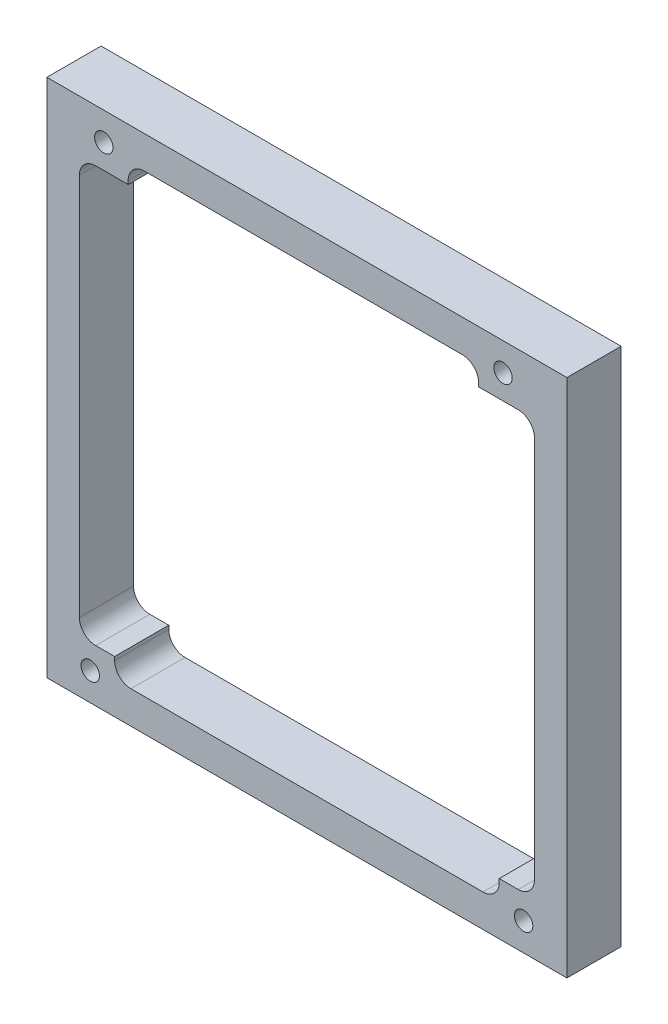
ISO-10303-21;
HEADER;
FILE_DESCRIPTION(('STEP AP214'),'2;1');
FILE_NAME('part.step','',(''),(''),'','','');
FILE_SCHEMA(('AUTOMOTIVE_DESIGN { 1 0 10303 214 1 1 1 1 }'));
ENDSEC;
DATA;
#1=APPLICATION_CONTEXT('core data for automotive mechanical design processes');
#2=APPLICATION_PROTOCOL_DEFINITION('international standard','automotive_design',2000,#1);
#3=PRODUCT_CONTEXT('',#1,'mechanical');
#4=PRODUCT('Part','Part','',(#3));
#5=PRODUCT_RELATED_PRODUCT_CATEGORY('part','',(#4));
#6=PRODUCT_DEFINITION_FORMATION('','',#4);
#7=PRODUCT_DEFINITION_CONTEXT('part definition',#1,'design');
#8=PRODUCT_DEFINITION('design','',#6,#7);
#9=PRODUCT_DEFINITION_SHAPE('','',#8);
#10=(LENGTH_UNIT() NAMED_UNIT(*) SI_UNIT(.MILLI.,.METRE.));
#11=(NAMED_UNIT(*) PLANE_ANGLE_UNIT() SI_UNIT($,.RADIAN.));
#12=(NAMED_UNIT(*) SI_UNIT($,.STERADIAN.) SOLID_ANGLE_UNIT());
#13=UNCERTAINTY_MEASURE_WITH_UNIT(LENGTH_MEASURE(1.E-05),#10,'distance_accuracy_value','');
#14=(GEOMETRIC_REPRESENTATION_CONTEXT(3) GLOBAL_UNCERTAINTY_ASSIGNED_CONTEXT((#13)) GLOBAL_UNIT_ASSIGNED_CONTEXT((#10,
#11,#12)) REPRESENTATION_CONTEXT('',''));
#15=CARTESIAN_POINT('',(0.,0.,0.));
#16=DIRECTION('',(0.,0.,1.));
#17=DIRECTION('',(1.,0.,0.));
#18=AXIS2_PLACEMENT_3D('',#15,#16,#17);
#19=CARTESIAN_POINT('',(0.,-42.,10.));
#20=DIRECTION('',(0.,-1.,0.));
#21=DIRECTION('',(0.,0.,-1.));
#22=AXIS2_PLACEMENT_3D('',#19,#20,#21);
#23=PLANE('',#22);
#24=DIRECTION('',(-1.,0.,0.));
#25=VECTOR('',#24,1.);
#26=CARTESIAN_POINT('',(0.,-42.,10.));
#27=LINE('',#26,#25);
#28=CARTESIAN_POINT('',(32.5,-42.,10.));
#29=VERTEX_POINT('',#28);
#30=CARTESIAN_POINT('',(-32.5,-42.,10.));
#31=VERTEX_POINT('',#30);
#32=EDGE_CURVE('E278',#29,#31,#27,.T.);
#33=ORIENTED_EDGE('',*,*,#32,.F.);
#34=DIRECTION('',(0.,0.,1.));
#35=VECTOR('',#34,1.);
#36=CARTESIAN_POINT('',(32.5,-42.,0.));
#37=LINE('',#36,#35);
#38=CARTESIAN_POINT('',(32.5,-42.,0.));
#39=VERTEX_POINT('',#38);
#40=EDGE_CURVE('E349',#29,#39,#37,.F.);
#41=ORIENTED_EDGE('',*,*,#40,.T.);
#42=DIRECTION('',(-1.,0.,0.));
#43=VECTOR('',#42,1.);
#44=CARTESIAN_POINT('',(0.,-42.,0.));
#45=LINE('',#44,#43);
#46=CARTESIAN_POINT('',(-32.5,-42.,0.));
#47=VERTEX_POINT('',#46);
#48=EDGE_CURVE('E301',#39,#47,#45,.T.);
#49=ORIENTED_EDGE('',*,*,#48,.T.);
#50=DIRECTION('',(0.,0.,1.));
#51=VECTOR('',#50,1.);
#52=CARTESIAN_POINT('',(-32.5,-42.,10.));
#53=LINE('',#52,#51);
#54=EDGE_CURVE('E346',#47,#31,#53,.T.);
#55=ORIENTED_EDGE('',*,*,#54,.T.);
#56=EDGE_LOOP('',(#33,#41,#49,#55));
#57=FACE_BOUND('',#56,.T.);
#58=ADVANCED_FACE('F37',(#57),#23,.F.);
#59=CARTESIAN_POINT('',(0.,42.,10.));
#60=DIRECTION('',(0.,-1.,0.));
#61=DIRECTION('',(0.,0.,-1.));
#62=AXIS2_PLACEMENT_3D('',#59,#60,#61);
#63=PLANE('',#62);
#64=DIRECTION('',(-1.,0.,0.));
#65=VECTOR('',#64,1.);
#66=CARTESIAN_POINT('',(0.,42.,10.));
#67=LINE('',#66,#65);
#68=CARTESIAN_POINT('',(28.7,42.,10.));
#69=VERTEX_POINT('',#68);
#70=CARTESIAN_POINT('',(-30.,42.,10.));
#71=VERTEX_POINT('',#70);
#72=EDGE_CURVE('E284',#69,#71,#67,.T.);
#73=ORIENTED_EDGE('',*,*,#72,.T.);
#74=DIRECTION('',(0.,0.,1.));
#75=VECTOR('',#74,1.);
#76=CARTESIAN_POINT('',(-30.,42.,10.));
#77=LINE('',#76,#75);
#78=CARTESIAN_POINT('',(-30.,42.,0.));
#79=VERTEX_POINT('',#78);
#80=EDGE_CURVE('E333',#71,#79,#77,.F.);
#81=ORIENTED_EDGE('',*,*,#80,.T.);
#82=DIRECTION('',(-1.,0.,0.));
#83=VECTOR('',#82,1.);
#84=CARTESIAN_POINT('',(0.,42.,0.));
#85=LINE('',#84,#83);
#86=CARTESIAN_POINT('',(28.7,42.,0.));
#87=VERTEX_POINT('',#86);
#88=EDGE_CURVE('E307',#87,#79,#85,.T.);
#89=ORIENTED_EDGE('',*,*,#88,.F.);
#90=DIRECTION('',(0.,0.,1.));
#91=VECTOR('',#90,1.);
#92=CARTESIAN_POINT('',(28.7,42.,10.));
#93=LINE('',#92,#91);
#94=EDGE_CURVE('E330',#87,#69,#93,.T.);
#95=ORIENTED_EDGE('',*,*,#94,.T.);
#96=EDGE_LOOP('',(#73,#81,#89,#95));
#97=FACE_BOUND('',#96,.T.);
#98=ADVANCED_FACE('F462',(#97),#63,.T.);
#99=CARTESIAN_POINT('',(42.,0.,10.));
#100=DIRECTION('',(-1.,0.,0.));
#101=DIRECTION('',(0.,0.,1.));
#102=AXIS2_PLACEMENT_3D('',#99,#100,#101);
#103=PLANE('',#102);
#104=DIRECTION('',(0.,1.,0.));
#105=VECTOR('',#104,1.);
#106=CARTESIAN_POINT('',(42.,0.,10.));
#107=LINE('',#106,#105);
#108=CARTESIAN_POINT('',(42.,-35.35,10.));
#109=VERTEX_POINT('',#108);
#110=CARTESIAN_POINT('',(42.,35.35,10.));
#111=VERTEX_POINT('',#110);
#112=EDGE_CURVE('E287',#109,#111,#107,.T.);
#113=ORIENTED_EDGE('',*,*,#112,.T.);
#114=DIRECTION('',(0.,0.,1.));
#115=VECTOR('',#114,1.);
#116=CARTESIAN_POINT('',(42.,35.35,10.));
#117=LINE('',#116,#115);
#118=CARTESIAN_POINT('',(42.,35.35,0.));
#119=VERTEX_POINT('',#118);
#120=EDGE_CURVE('E343',#111,#119,#117,.F.);
#121=ORIENTED_EDGE('',*,*,#120,.T.);
#122=DIRECTION('',(0.,1.,0.));
#123=VECTOR('',#122,1.);
#124=CARTESIAN_POINT('',(42.,0.,0.));
#125=LINE('',#124,#123);
#126=CARTESIAN_POINT('',(42.,-35.35,0.));
#127=VERTEX_POINT('',#126);
#128=EDGE_CURVE('E271',#127,#119,#125,.T.);
#129=ORIENTED_EDGE('',*,*,#128,.F.);
#130=DIRECTION('',(0.,0.,1.));
#131=VECTOR('',#130,1.);
#132=CARTESIAN_POINT('',(42.,-35.35,10.));
#133=LINE('',#132,#131);
#134=EDGE_CURVE('E340',#127,#109,#133,.T.);
#135=ORIENTED_EDGE('',*,*,#134,.T.);
#136=EDGE_LOOP('',(#113,#121,#129,#135));
#137=FACE_BOUND('',#136,.T.);
#138=ADVANCED_FACE('F467',(#137),#103,.T.);
#139=CARTESIAN_POINT('',(-42.,0.,10.));
#140=DIRECTION('',(-1.,0.,0.));
#141=DIRECTION('',(0.,0.,1.));
#142=AXIS2_PLACEMENT_3D('',#139,#140,#141);
#143=PLANE('',#142);
#144=DIRECTION('',(0.,1.,0.));
#145=VECTOR('',#144,1.);
#146=CARTESIAN_POINT('',(-42.,0.,0.));
#147=LINE('',#146,#145);
#148=CARTESIAN_POINT('',(-42.,-35.35,0.));
#149=VERTEX_POINT('',#148);
#150=CARTESIAN_POINT('',(-42.,35.35,0.));
#151=VERTEX_POINT('',#150);
#152=EDGE_CURVE('E304',#149,#151,#147,.T.);
#153=ORIENTED_EDGE('',*,*,#152,.T.);
#154=DIRECTION('',(0.,0.,1.));
#155=VECTOR('',#154,1.);
#156=CARTESIAN_POINT('',(-42.,35.35,10.));
#157=LINE('',#156,#155);
#158=CARTESIAN_POINT('',(-42.,35.35,10.));
#159=VERTEX_POINT('',#158);
#160=EDGE_CURVE('E322',#151,#159,#157,.T.);
#161=ORIENTED_EDGE('',*,*,#160,.T.);
#162=DIRECTION('',(0.,1.,0.));
#163=VECTOR('',#162,1.);
#164=CARTESIAN_POINT('',(-42.,0.,10.));
#165=LINE('',#164,#163);
#166=CARTESIAN_POINT('',(-42.,-35.35,10.));
#167=VERTEX_POINT('',#166);
#168=EDGE_CURVE('E281',#167,#159,#165,.T.);
#169=ORIENTED_EDGE('',*,*,#168,.F.);
#170=DIRECTION('',(0.,0.,1.));
#171=VECTOR('',#170,1.);
#172=CARTESIAN_POINT('',(-42.,-35.35,10.));
#173=LINE('',#172,#171);
#174=EDGE_CURVE('E320',#167,#149,#173,.F.);
#175=ORIENTED_EDGE('',*,*,#174,.T.);
#176=EDGE_LOOP('',(#153,#161,#169,#175));
#177=FACE_BOUND('',#176,.T.);
#178=ADVANCED_FACE('F386',(#177),#143,.F.);
#179=CARTESIAN_POINT('',(-48.,0.,10.));
#180=DIRECTION('',(-1.,0.,0.));
#181=DIRECTION('',(0.,0.,1.));
#182=AXIS2_PLACEMENT_3D('',#179,#180,#181);
#183=PLANE('',#182);
#184=DIRECTION('',(0.,1.,0.));
#185=VECTOR('',#184,1.);
#186=CARTESIAN_POINT('',(-48.,0.,0.));
#187=LINE('',#186,#185);
#188=CARTESIAN_POINT('',(-48.,-48.,0.));
#189=VERTEX_POINT('',#188);
#190=CARTESIAN_POINT('',(-48.,48.,0.));
#191=VERTEX_POINT('',#190);
#192=EDGE_CURVE('E256',#189,#191,#187,.T.);
#193=ORIENTED_EDGE('',*,*,#192,.F.);
#194=DIRECTION('',(0.,0.,-1.));
#195=VECTOR('',#194,1.);
#196=CARTESIAN_POINT('',(-48.,-48.,10.));
#197=LINE('',#196,#195);
#198=CARTESIAN_POINT('',(-48.,-48.,10.));
#199=VERTEX_POINT('',#198);
#200=EDGE_CURVE('E318',#199,#189,#197,.T.);
#201=ORIENTED_EDGE('',*,*,#200,.F.);
#202=DIRECTION('',(0.,1.,0.));
#203=VECTOR('',#202,1.);
#204=CARTESIAN_POINT('',(-48.,0.,10.));
#205=LINE('',#204,#203);
#206=CARTESIAN_POINT('',(-48.,48.,10.));
#207=VERTEX_POINT('',#206);
#208=EDGE_CURVE('E267',#199,#207,#205,.T.);
#209=ORIENTED_EDGE('',*,*,#208,.T.);
#210=DIRECTION('',(0.,0.,-1.));
#211=VECTOR('',#210,1.);
#212=CARTESIAN_POINT('',(-48.,48.,10.));
#213=LINE('',#212,#211);
#214=EDGE_CURVE('E290',#207,#191,#213,.T.);
#215=ORIENTED_EDGE('',*,*,#214,.T.);
#216=EDGE_LOOP('',(#193,#201,#209,#215));
#217=FACE_BOUND('',#216,.T.);
#218=ADVANCED_FACE('F483',(#217),#183,.T.);
#219=CARTESIAN_POINT('',(0.,-48.,10.));
#220=DIRECTION('',(0.,-1.,0.));
#221=DIRECTION('',(1.,0.,0.));
#222=AXIS2_PLACEMENT_3D('',#219,#220,#221);
#223=PLANE('',#222);
#224=DIRECTION('',(-1.,0.,0.));
#225=VECTOR('',#224,1.);
#226=CARTESIAN_POINT('',(0.,-48.,0.));
#227=LINE('',#226,#225);
#228=CARTESIAN_POINT('',(48.,-48.,0.));
#229=VERTEX_POINT('',#228);
#230=EDGE_CURVE('E293',#229,#189,#227,.T.);
#231=ORIENTED_EDGE('',*,*,#230,.F.);
#232=DIRECTION('',(0.,0.,-1.));
#233=VECTOR('',#232,1.);
#234=CARTESIAN_POINT('',(48.,-48.,10.));
#235=LINE('',#234,#233);
#236=CARTESIAN_POINT('',(48.,-48.,10.));
#237=VERTEX_POINT('',#236);
#238=EDGE_CURVE('E316',#237,#229,#235,.T.);
#239=ORIENTED_EDGE('',*,*,#238,.F.);
#240=DIRECTION('',(-1.,0.,0.));
#241=VECTOR('',#240,1.);
#242=CARTESIAN_POINT('',(0.,-48.,10.));
#243=LINE('',#242,#241);
#244=EDGE_CURVE('E270',#237,#199,#243,.T.);
#245=ORIENTED_EDGE('',*,*,#244,.T.);
#246=ORIENTED_EDGE('',*,*,#200,.T.);
#247=EDGE_LOOP('',(#231,#239,#245,#246));
#248=FACE_BOUND('',#247,.T.);
#249=ADVANCED_FACE('F479',(#248),#223,.T.);
#250=CARTESIAN_POINT('',(48.,0.,10.));
#251=DIRECTION('',(-1.,0.,0.));
#252=DIRECTION('',(0.,0.,1.));
#253=AXIS2_PLACEMENT_3D('',#250,#251,#252);
#254=PLANE('',#253);
#255=DIRECTION('',(0.,1.,0.));
#256=VECTOR('',#255,1.);
#257=CARTESIAN_POINT('',(48.,0.,0.));
#258=LINE('',#257,#256);
#259=CARTESIAN_POINT('',(48.,48.,0.));
#260=VERTEX_POINT('',#259);
#261=EDGE_CURVE('E296',#229,#260,#258,.T.);
#262=ORIENTED_EDGE('',*,*,#261,.T.);
#263=DIRECTION('',(0.,0.,-1.));
#264=VECTOR('',#263,1.);
#265=CARTESIAN_POINT('',(48.,48.,10.));
#266=LINE('',#265,#264);
#267=CARTESIAN_POINT('',(48.,48.,10.));
#268=VERTEX_POINT('',#267);
#269=EDGE_CURVE('E313',#268,#260,#266,.T.);
#270=ORIENTED_EDGE('',*,*,#269,.F.);
#271=DIRECTION('',(0.,1.,0.));
#272=VECTOR('',#271,1.);
#273=CARTESIAN_POINT('',(48.,0.,10.));
#274=LINE('',#273,#272);
#275=EDGE_CURVE('E274',#237,#268,#274,.T.);
#276=ORIENTED_EDGE('',*,*,#275,.F.);
#277=ORIENTED_EDGE('',*,*,#238,.T.);
#278=EDGE_LOOP('',(#262,#270,#276,#277));
#279=FACE_BOUND('',#278,.T.);
#280=ADVANCED_FACE('F475',(#279),#254,.F.);
#281=CARTESIAN_POINT('',(0.,48.,10.));
#282=DIRECTION('',(0.,-1.,0.));
#283=DIRECTION('',(1.,0.,0.));
#284=AXIS2_PLACEMENT_3D('',#281,#282,#283);
#285=PLANE('',#284);
#286=DIRECTION('',(-1.,0.,0.));
#287=VECTOR('',#286,1.);
#288=CARTESIAN_POINT('',(0.,48.,0.));
#289=LINE('',#288,#287);
#290=EDGE_CURVE('E298',#260,#191,#289,.T.);
#291=ORIENTED_EDGE('',*,*,#290,.T.);
#292=ORIENTED_EDGE('',*,*,#214,.F.);
#293=DIRECTION('',(-1.,0.,0.));
#294=VECTOR('',#293,1.);
#295=CARTESIAN_POINT('',(0.,48.,10.));
#296=LINE('',#295,#294);
#297=EDGE_CURVE('E276',#268,#207,#296,.T.);
#298=ORIENTED_EDGE('',*,*,#297,.F.);
#299=ORIENTED_EDGE('',*,*,#269,.T.);
#300=EDGE_LOOP('',(#291,#292,#298,#299));
#301=FACE_BOUND('',#300,.T.);
#302=ADVANCED_FACE('F472',(#301),#285,.F.);
#303=CARTESIAN_POINT('',(0.,0.,10.));
#304=DIRECTION('',(0.,0.,1.));
#305=DIRECTION('',(1.,0.,0.));
#306=AXIS2_PLACEMENT_3D('',#303,#304,#305);
#307=PLANE('',#306);
#308=CARTESIAN_POINT('',(36.2,42.85,10.));
#309=DIRECTION('',(0.,0.,-1.));
#310=DIRECTION('',(-1.,0.,0.));
#311=AXIS2_PLACEMENT_3D('',#308,#309,#310);
#312=CIRCLE('',#311,1.7);
#313=CARTESIAN_POINT('',(34.5,42.85,10.));
#314=VERTEX_POINT('',#313);
#315=EDGE_CURVE('E428',#314,#314,#312,.T.);
#316=ORIENTED_EDGE('',*,*,#315,.T.);
#317=EDGE_LOOP('',(#316));
#318=FACE_BOUND('',#317,.T.);
#319=CARTESIAN_POINT('',(-37.5,42.85,10.));
#320=DIRECTION('',(0.,0.,-1.));
#321=DIRECTION('',(-1.,0.,0.));
#322=AXIS2_PLACEMENT_3D('',#319,#320,#321);
#323=CIRCLE('',#322,1.7);
#324=CARTESIAN_POINT('',(-39.2,42.85,10.));
#325=VERTEX_POINT('',#324);
#326=EDGE_CURVE('E422',#325,#325,#323,.T.);
#327=ORIENTED_EDGE('',*,*,#326,.T.);
#328=EDGE_LOOP('',(#327));
#329=FACE_BOUND('',#328,.T.);
#330=CARTESIAN_POINT('',(-40.,-42.85,10.));
#331=DIRECTION('',(0.,0.,-1.));
#332=DIRECTION('',(-1.,0.,0.));
#333=AXIS2_PLACEMENT_3D('',#330,#331,#332);
#334=CIRCLE('',#333,1.7);
#335=CARTESIAN_POINT('',(-41.7,-42.85,10.));
#336=VERTEX_POINT('',#335);
#337=EDGE_CURVE('E416',#336,#336,#334,.T.);
#338=ORIENTED_EDGE('',*,*,#337,.T.);
#339=EDGE_LOOP('',(#338));
#340=FACE_BOUND('',#339,.T.);
#341=CARTESIAN_POINT('',(40.,-42.85,10.));
#342=DIRECTION('',(0.,0.,-1.));
#343=DIRECTION('',(-1.,0.,0.));
#344=AXIS2_PLACEMENT_3D('',#341,#342,#343);
#345=CIRCLE('',#344,1.7);
#346=CARTESIAN_POINT('',(38.3,-42.85,10.));
#347=VERTEX_POINT('',#346);
#348=EDGE_CURVE('E217',#347,#347,#345,.T.);
#349=ORIENTED_EDGE('',*,*,#348,.T.);
#350=EDGE_LOOP('',(#349));
#351=FACE_BOUND('',#350,.T.);
#352=DIRECTION('',(0.,1.,0.));
#353=VECTOR('',#352,1.);
#354=CARTESIAN_POINT('',(35.5,0.,10.));
#355=LINE('',#354,#353);
#356=CARTESIAN_POINT('',(35.5,-39.,10.));
#357=VERTEX_POINT('',#356);
#358=CARTESIAN_POINT('',(35.5,-38.35,10.));
#359=VERTEX_POINT('',#358);
#360=EDGE_CURVE('E201',#357,#359,#355,.T.);
#361=ORIENTED_EDGE('',*,*,#360,.F.);
#362=CARTESIAN_POINT('',(32.5,-39.,10.));
#363=DIRECTION('',(0.,0.,1.));
#364=DIRECTION('',(1.,0.,0.));
#365=AXIS2_PLACEMENT_3D('',#362,#363,#364);
#366=CIRCLE('',#365,3.);
#367=EDGE_CURVE('E373',#357,#29,#366,.F.);
#368=ORIENTED_EDGE('',*,*,#367,.T.);
#369=ORIENTED_EDGE('',*,*,#32,.T.);
#370=CARTESIAN_POINT('',(-32.5,-39.,10.));
#371=DIRECTION('',(0.,0.,1.));
#372=DIRECTION('',(1.,0.,0.));
#373=AXIS2_PLACEMENT_3D('',#370,#371,#372);
#374=CIRCLE('',#373,3.);
#375=CARTESIAN_POINT('',(-35.5,-39.,10.));
#376=VERTEX_POINT('',#375);
#377=EDGE_CURVE('E380',#31,#376,#374,.F.);
#378=ORIENTED_EDGE('',*,*,#377,.T.);
#379=DIRECTION('',(0.,1.,0.));
#380=VECTOR('',#379,1.);
#381=CARTESIAN_POINT('',(-35.5,0.,10.));
#382=LINE('',#381,#380);
#383=CARTESIAN_POINT('',(-35.5,-38.35,10.));
#384=VERTEX_POINT('',#383);
#385=EDGE_CURVE('E231',#376,#384,#382,.T.);
#386=ORIENTED_EDGE('',*,*,#385,.T.);
#387=DIRECTION('',(-1.,0.,0.));
#388=VECTOR('',#387,1.);
#389=CARTESIAN_POINT('',(0.,-38.35,10.));
#390=LINE('',#389,#388);
#391=CARTESIAN_POINT('',(-39.,-38.35,10.));
#392=VERTEX_POINT('',#391);
#393=EDGE_CURVE('E233',#384,#392,#390,.T.);
#394=ORIENTED_EDGE('',*,*,#393,.T.);
#395=CARTESIAN_POINT('',(-39.,-35.35,10.));
#396=DIRECTION('',(0.,0.,1.));
#397=DIRECTION('',(1.,0.,0.));
#398=AXIS2_PLACEMENT_3D('',#395,#396,#397);
#399=CIRCLE('',#398,3.);
#400=EDGE_CURVE('E45',#392,#167,#399,.F.);
#401=ORIENTED_EDGE('',*,*,#400,.T.);
#402=ORIENTED_EDGE('',*,*,#168,.T.);
#403=CARTESIAN_POINT('',(-39.,35.35,10.));
#404=DIRECTION('',(0.,0.,1.));
#405=DIRECTION('',(1.,0.,0.));
#406=AXIS2_PLACEMENT_3D('',#403,#404,#405);
#407=CIRCLE('',#406,3.);
#408=CARTESIAN_POINT('',(-39.,38.35,10.));
#409=VERTEX_POINT('',#408);
#410=EDGE_CURVE('E357',#159,#409,#407,.F.);
#411=ORIENTED_EDGE('',*,*,#410,.T.);
#412=DIRECTION('',(1.,0.,0.));
#413=VECTOR('',#412,1.);
#414=CARTESIAN_POINT('',(0.,38.3500000000001,10.));
#415=LINE('',#414,#413);
#416=CARTESIAN_POINT('',(-33.,38.35,10.));
#417=VERTEX_POINT('',#416);
#418=EDGE_CURVE('E249',#409,#417,#415,.T.);
#419=ORIENTED_EDGE('',*,*,#418,.T.);
#420=DIRECTION('',(0.,-1.,0.));
#421=VECTOR('',#420,1.);
#422=CARTESIAN_POINT('',(-33.,0.,10.));
#423=LINE('',#422,#421);
#424=CARTESIAN_POINT('',(-33.,39.,10.));
#425=VERTEX_POINT('',#424);
#426=EDGE_CURVE('E239',#425,#417,#423,.T.);
#427=ORIENTED_EDGE('',*,*,#426,.F.);
#428=CARTESIAN_POINT('',(-30.,39.,10.));
#429=DIRECTION('',(0.,0.,1.));
#430=DIRECTION('',(1.,0.,0.));
#431=AXIS2_PLACEMENT_3D('',#428,#429,#430);
#432=CIRCLE('',#431,3.);
#433=EDGE_CURVE('E361',#425,#71,#432,.F.);
#434=ORIENTED_EDGE('',*,*,#433,.T.);
#435=ORIENTED_EDGE('',*,*,#72,.F.);
#436=CARTESIAN_POINT('',(28.7,39.,10.));
#437=DIRECTION('',(0.,0.,1.));
#438=DIRECTION('',(1.,0.,0.));
#439=AXIS2_PLACEMENT_3D('',#436,#437,#438);
#440=CIRCLE('',#439,3.);
#441=CARTESIAN_POINT('',(31.7,39.,10.));
#442=VERTEX_POINT('',#441);
#443=EDGE_CURVE('E365',#69,#442,#440,.F.);
#444=ORIENTED_EDGE('',*,*,#443,.T.);
#445=DIRECTION('',(0.,1.,0.));
#446=VECTOR('',#445,1.);
#447=CARTESIAN_POINT('',(31.7,0.,10.));
#448=LINE('',#447,#446);
#449=CARTESIAN_POINT('',(31.7,38.35,10.));
#450=VERTEX_POINT('',#449);
#451=EDGE_CURVE('E247',#450,#442,#448,.T.);
#452=ORIENTED_EDGE('',*,*,#451,.F.);
#453=DIRECTION('',(-1.,0.,0.));
#454=VECTOR('',#453,1.);
#455=CARTESIAN_POINT('',(0.,38.35,10.));
#456=LINE('',#455,#454);
#457=CARTESIAN_POINT('',(39.,38.35,10.));
#458=VERTEX_POINT('',#457);
#459=EDGE_CURVE('E260',#458,#450,#456,.T.);
#460=ORIENTED_EDGE('',*,*,#459,.F.);
#461=CARTESIAN_POINT('',(39.,35.35,10.));
#462=DIRECTION('',(0.,0.,1.));
#463=DIRECTION('',(1.,0.,0.));
#464=AXIS2_PLACEMENT_3D('',#461,#462,#463);
#465=CIRCLE('',#464,3.);
#466=EDGE_CURVE('E369',#458,#111,#465,.F.);
#467=ORIENTED_EDGE('',*,*,#466,.T.);
#468=ORIENTED_EDGE('',*,*,#112,.F.);
#469=CARTESIAN_POINT('',(39.,-35.35,10.));
#470=DIRECTION('',(0.,0.,1.));
#471=DIRECTION('',(1.,0.,0.));
#472=AXIS2_PLACEMENT_3D('',#469,#470,#471);
#473=CIRCLE('',#472,3.);
#474=CARTESIAN_POINT('',(39.,-38.35,10.));
#475=VERTEX_POINT('',#474);
#476=EDGE_CURVE('E203',#109,#475,#473,.F.);
#477=ORIENTED_EDGE('',*,*,#476,.T.);
#478=DIRECTION('',(-1.,0.,0.));
#479=VECTOR('',#478,1.);
#480=CARTESIAN_POINT('',(0.,-38.35,10.));
#481=LINE('',#480,#479);
#482=EDGE_CURVE('E197',#475,#359,#481,.T.);
#483=ORIENTED_EDGE('',*,*,#482,.T.);
#484=EDGE_LOOP('',(#361,#368,#369,#378,#386,#394,#401,#402,#411,#419,#427,#434,#435,#444,#452,
#460,#467,#468,#477,#483));
#485=FACE_BOUND('',#484,.T.);
#486=ORIENTED_EDGE('',*,*,#208,.F.);
#487=ORIENTED_EDGE('',*,*,#244,.F.);
#488=ORIENTED_EDGE('',*,*,#275,.T.);
#489=ORIENTED_EDGE('',*,*,#297,.T.);
#490=EDGE_LOOP('',(#486,#487,#488,#489));
#491=FACE_BOUND('',#490,.T.);
#492=ADVANCED_FACE('F199',(#318,#329,#340,#351,#485,#491),#307,.T.);
#493=CARTESIAN_POINT('',(0.,0.,0.));
#494=DIRECTION('',(0.,0.,1.));
#495=DIRECTION('',(1.,0.,0.));
#496=AXIS2_PLACEMENT_3D('',#493,#494,#495);
#497=PLANE('',#496);
#498=CARTESIAN_POINT('',(36.2,42.85,0.));
#499=DIRECTION('',(0.,0.,-1.));
#500=DIRECTION('',(-1.,0.,0.));
#501=AXIS2_PLACEMENT_3D('',#498,#499,#500);
#502=CIRCLE('',#501,1.7);
#503=CARTESIAN_POINT('',(34.5,42.85,0.));
#504=VERTEX_POINT('',#503);
#505=EDGE_CURVE('E431',#504,#504,#502,.T.);
#506=ORIENTED_EDGE('',*,*,#505,.F.);
#507=EDGE_LOOP('',(#506));
#508=FACE_BOUND('',#507,.T.);
#509=CARTESIAN_POINT('',(-37.5,42.85,0.));
#510=DIRECTION('',(0.,0.,-1.));
#511=DIRECTION('',(-1.,0.,0.));
#512=AXIS2_PLACEMENT_3D('',#509,#510,#511);
#513=CIRCLE('',#512,1.7);
#514=CARTESIAN_POINT('',(-39.2,42.85,0.));
#515=VERTEX_POINT('',#514);
#516=EDGE_CURVE('E425',#515,#515,#513,.T.);
#517=ORIENTED_EDGE('',*,*,#516,.F.);
#518=EDGE_LOOP('',(#517));
#519=FACE_BOUND('',#518,.T.);
#520=CARTESIAN_POINT('',(-40.,-42.85,0.));
#521=DIRECTION('',(0.,0.,-1.));
#522=DIRECTION('',(-1.,0.,0.));
#523=AXIS2_PLACEMENT_3D('',#520,#521,#522);
#524=CIRCLE('',#523,1.7);
#525=CARTESIAN_POINT('',(-41.7,-42.85,0.));
#526=VERTEX_POINT('',#525);
#527=EDGE_CURVE('E419',#526,#526,#524,.T.);
#528=ORIENTED_EDGE('',*,*,#527,.F.);
#529=EDGE_LOOP('',(#528));
#530=FACE_BOUND('',#529,.T.);
#531=CARTESIAN_POINT('',(40.,-42.85,0.));
#532=DIRECTION('',(0.,0.,-1.));
#533=DIRECTION('',(-1.,0.,0.));
#534=AXIS2_PLACEMENT_3D('',#531,#532,#533);
#535=CIRCLE('',#534,1.7);
#536=CARTESIAN_POINT('',(38.3,-42.85,0.));
#537=VERTEX_POINT('',#536);
#538=EDGE_CURVE('E413',#537,#537,#535,.T.);
#539=ORIENTED_EDGE('',*,*,#538,.F.);
#540=EDGE_LOOP('',(#539));
#541=FACE_BOUND('',#540,.T.);
#542=ORIENTED_EDGE('',*,*,#48,.F.);
#543=CARTESIAN_POINT('',(32.5,-39.,0.));
#544=DIRECTION('',(0.,0.,1.));
#545=DIRECTION('',(1.,0.,0.));
#546=AXIS2_PLACEMENT_3D('',#543,#544,#545);
#547=CIRCLE('',#546,3.);
#548=CARTESIAN_POINT('',(35.5,-39.,0.));
#549=VERTEX_POINT('',#548);
#550=EDGE_CURVE('E375',#39,#549,#547,.T.);
#551=ORIENTED_EDGE('',*,*,#550,.T.);
#552=DIRECTION('',(0.,-1.,0.));
#553=VECTOR('',#552,1.);
#554=CARTESIAN_POINT('',(35.5,0.,0.));
#555=LINE('',#554,#553);
#556=CARTESIAN_POINT('',(35.5,-38.35,0.));
#557=VERTEX_POINT('',#556);
#558=EDGE_CURVE('E223',#557,#549,#555,.T.);
#559=ORIENTED_EDGE('',*,*,#558,.F.);
#560=DIRECTION('',(1.,0.,0.));
#561=VECTOR('',#560,1.);
#562=CARTESIAN_POINT('',(0.,-38.35,0.));
#563=LINE('',#562,#561);
#564=CARTESIAN_POINT('',(39.,-38.35,0.));
#565=VERTEX_POINT('',#564);
#566=EDGE_CURVE('E221',#557,#565,#563,.T.);
#567=ORIENTED_EDGE('',*,*,#566,.T.);
#568=CARTESIAN_POINT('',(39.,-35.35,0.));
#569=DIRECTION('',(0.,0.,1.));
#570=DIRECTION('',(1.,0.,0.));
#571=AXIS2_PLACEMENT_3D('',#568,#569,#570);
#572=CIRCLE('',#571,3.);
#573=EDGE_CURVE('E378',#565,#127,#572,.T.);
#574=ORIENTED_EDGE('',*,*,#573,.T.);
#575=ORIENTED_EDGE('',*,*,#128,.T.);
#576=CARTESIAN_POINT('',(39.,35.35,0.));
#577=DIRECTION('',(0.,0.,1.));
#578=DIRECTION('',(1.,0.,0.));
#579=AXIS2_PLACEMENT_3D('',#576,#577,#578);
#580=CIRCLE('',#579,3.);
#581=CARTESIAN_POINT('',(39.,38.35,0.));
#582=VERTEX_POINT('',#581);
#583=EDGE_CURVE('E371',#119,#582,#580,.T.);
#584=ORIENTED_EDGE('',*,*,#583,.T.);
#585=DIRECTION('',(1.,0.,0.));
#586=VECTOR('',#585,1.);
#587=CARTESIAN_POINT('',(0.,38.35,0.));
#588=LINE('',#587,#586);
#589=CARTESIAN_POINT('',(31.7,38.35,0.));
#590=VERTEX_POINT('',#589);
#591=EDGE_CURVE('E257',#590,#582,#588,.T.);
#592=ORIENTED_EDGE('',*,*,#591,.F.);
#593=DIRECTION('',(0.,-1.,0.));
#594=VECTOR('',#593,1.);
#595=CARTESIAN_POINT('',(31.7,0.,0.));
#596=LINE('',#595,#594);
#597=CARTESIAN_POINT('',(31.7,39.,0.));
#598=VERTEX_POINT('',#597);
#599=EDGE_CURVE('E254',#598,#590,#596,.T.);
#600=ORIENTED_EDGE('',*,*,#599,.F.);
#601=CARTESIAN_POINT('',(28.7,39.,0.));
#602=DIRECTION('',(0.,0.,1.));
#603=DIRECTION('',(1.,0.,0.));
#604=AXIS2_PLACEMENT_3D('',#601,#602,#603);
#605=CIRCLE('',#604,3.);
#606=EDGE_CURVE('E367',#598,#87,#605,.T.);
#607=ORIENTED_EDGE('',*,*,#606,.T.);
#608=ORIENTED_EDGE('',*,*,#88,.T.);
#609=CARTESIAN_POINT('',(-30.,39.,0.));
#610=DIRECTION('',(0.,0.,1.));
#611=DIRECTION('',(1.,0.,0.));
#612=AXIS2_PLACEMENT_3D('',#609,#610,#611);
#613=CIRCLE('',#612,3.);
#614=CARTESIAN_POINT('',(-33.,39.,0.));
#615=VERTEX_POINT('',#614);
#616=EDGE_CURVE('E363',#79,#615,#613,.T.);
#617=ORIENTED_EDGE('',*,*,#616,.T.);
#618=DIRECTION('',(0.,1.,0.));
#619=VECTOR('',#618,1.);
#620=CARTESIAN_POINT('',(-33.,0.,0.));
#621=LINE('',#620,#619);
#622=CARTESIAN_POINT('',(-33.,38.35,0.));
#623=VERTEX_POINT('',#622);
#624=EDGE_CURVE('E243',#623,#615,#621,.T.);
#625=ORIENTED_EDGE('',*,*,#624,.F.);
#626=DIRECTION('',(-1.,0.,0.));
#627=VECTOR('',#626,1.);
#628=CARTESIAN_POINT('',(0.,38.3500000000001,0.));
#629=LINE('',#628,#627);
#630=CARTESIAN_POINT('',(-39.,38.35,0.));
#631=VERTEX_POINT('',#630);
#632=EDGE_CURVE('E240',#623,#631,#629,.T.);
#633=ORIENTED_EDGE('',*,*,#632,.T.);
#634=CARTESIAN_POINT('',(-39.,35.35,0.));
#635=DIRECTION('',(0.,0.,1.));
#636=DIRECTION('',(1.,0.,0.));
#637=AXIS2_PLACEMENT_3D('',#634,#635,#636);
#638=CIRCLE('',#637,3.);
#639=EDGE_CURVE('E359',#631,#151,#638,.T.);
#640=ORIENTED_EDGE('',*,*,#639,.T.);
#641=ORIENTED_EDGE('',*,*,#152,.F.);
#642=CARTESIAN_POINT('',(-39.,-35.35,0.));
#643=DIRECTION('',(0.,0.,1.));
#644=DIRECTION('',(1.,0.,0.));
#645=AXIS2_PLACEMENT_3D('',#642,#643,#644);
#646=CIRCLE('',#645,3.);
#647=CARTESIAN_POINT('',(-39.,-38.35,0.));
#648=VERTEX_POINT('',#647);
#649=EDGE_CURVE('E11',#149,#648,#646,.T.);
#650=ORIENTED_EDGE('',*,*,#649,.T.);
#651=DIRECTION('',(1.,0.,0.));
#652=VECTOR('',#651,1.);
#653=CARTESIAN_POINT('',(0.,-38.35,0.));
#654=LINE('',#653,#652);
#655=CARTESIAN_POINT('',(-35.5,-38.35,0.));
#656=VERTEX_POINT('',#655);
#657=EDGE_CURVE('E229',#648,#656,#654,.T.);
#658=ORIENTED_EDGE('',*,*,#657,.T.);
#659=DIRECTION('',(0.,-1.,0.));
#660=VECTOR('',#659,1.);
#661=CARTESIAN_POINT('',(-35.5,0.,0.));
#662=LINE('',#661,#660);
#663=CARTESIAN_POINT('',(-35.5,-39.,0.));
#664=VERTEX_POINT('',#663);
#665=EDGE_CURVE('E226',#656,#664,#662,.T.);
#666=ORIENTED_EDGE('',*,*,#665,.T.);
#667=CARTESIAN_POINT('',(-32.5,-39.,0.));
#668=DIRECTION('',(0.,0.,1.));
#669=DIRECTION('',(1.,0.,0.));
#670=AXIS2_PLACEMENT_3D('',#667,#668,#669);
#671=CIRCLE('',#670,3.);
#672=EDGE_CURVE('E382',#664,#47,#671,.T.);
#673=ORIENTED_EDGE('',*,*,#672,.T.);
#674=EDGE_LOOP('',(#542,#551,#559,#567,#574,#575,#584,#592,#600,#607,#608,#617,#625,#633,#640,
#641,#650,#658,#666,#673));
#675=FACE_BOUND('',#674,.T.);
#676=ORIENTED_EDGE('',*,*,#192,.T.);
#677=ORIENTED_EDGE('',*,*,#290,.F.);
#678=ORIENTED_EDGE('',*,*,#261,.F.);
#679=ORIENTED_EDGE('',*,*,#230,.T.);
#680=EDGE_LOOP('',(#676,#677,#678,#679));
#681=FACE_BOUND('',#680,.T.);
#682=ADVANCED_FACE('F393',(#508,#519,#530,#541,#675,#681),#497,.F.);
#683=CARTESIAN_POINT('',(0.,38.35,-10.9276026648117));
#684=DIRECTION('',(0.,1.,0.));
#685=DIRECTION('',(-1.,0.,0.));
#686=AXIS2_PLACEMENT_3D('',#683,#684,#685);
#687=PLANE('',#686);
#688=ORIENTED_EDGE('',*,*,#591,.T.);
#689=DIRECTION('',(0.,0.,1.));
#690=VECTOR('',#689,1.);
#691=CARTESIAN_POINT('',(39.,38.35,-10.9276026648117));
#692=LINE('',#691,#690);
#693=EDGE_CURVE('E337',#582,#458,#692,.T.);
#694=ORIENTED_EDGE('',*,*,#693,.T.);
#695=ORIENTED_EDGE('',*,*,#459,.T.);
#696=DIRECTION('',(0.,0.,1.));
#697=VECTOR('',#696,1.);
#698=CARTESIAN_POINT('',(31.7,38.35,-10.9276026648117));
#699=LINE('',#698,#697);
#700=EDGE_CURVE('E262',#590,#450,#699,.T.);
#701=ORIENTED_EDGE('',*,*,#700,.F.);
#702=EDGE_LOOP('',(#688,#694,#695,#701));
#703=FACE_BOUND('',#702,.T.);
#704=ADVANCED_FACE('F439',(#703),#687,.F.);
#705=CARTESIAN_POINT('',(31.7,0.,-10.9276026648117));
#706=DIRECTION('',(1.,0.,0.));
#707=DIRECTION('',(0.,0.,-1.));
#708=AXIS2_PLACEMENT_3D('',#705,#706,#707);
#709=PLANE('',#708);
#710=ORIENTED_EDGE('',*,*,#451,.T.);
#711=DIRECTION('',(0.,0.,1.));
#712=VECTOR('',#711,1.);
#713=CARTESIAN_POINT('',(31.7,39.,-10.9276026648117));
#714=LINE('',#713,#712);
#715=EDGE_CURVE('E335',#442,#598,#714,.F.);
#716=ORIENTED_EDGE('',*,*,#715,.T.);
#717=ORIENTED_EDGE('',*,*,#599,.T.);
#718=ORIENTED_EDGE('',*,*,#700,.T.);
#719=EDGE_LOOP('',(#710,#716,#717,#718));
#720=FACE_BOUND('',#719,.T.);
#721=ADVANCED_FACE('F601',(#720),#709,.F.);
#722=CARTESIAN_POINT('',(0.,38.3500000000001,-10.9276026648117));
#723=DIRECTION('',(0.,-1.,0.));
#724=DIRECTION('',(1.,0.,0.));
#725=AXIS2_PLACEMENT_3D('',#722,#723,#724);
#726=PLANE('',#725);
#727=ORIENTED_EDGE('',*,*,#418,.F.);
#728=DIRECTION('',(0.,0.,1.));
#729=VECTOR('',#728,1.);
#730=CARTESIAN_POINT('',(-39.,38.35,-10.9276026648117));
#731=LINE('',#730,#729);
#732=EDGE_CURVE('E325',#409,#631,#731,.F.);
#733=ORIENTED_EDGE('',*,*,#732,.T.);
#734=ORIENTED_EDGE('',*,*,#632,.F.);
#735=DIRECTION('',(0.,0.,1.));
#736=VECTOR('',#735,1.);
#737=CARTESIAN_POINT('',(-33.,38.35,-10.9276026648117));
#738=LINE('',#737,#736);
#739=EDGE_CURVE('E244',#623,#417,#738,.T.);
#740=ORIENTED_EDGE('',*,*,#739,.T.);
#741=EDGE_LOOP('',(#727,#733,#734,#740));
#742=FACE_BOUND('',#741,.T.);
#743=ADVANCED_FACE('F610',(#742),#726,.T.);
#744=CARTESIAN_POINT('',(-33.,0.,-10.9276026648117));
#745=DIRECTION('',(-1.,0.,0.));
#746=DIRECTION('',(0.,0.,1.));
#747=AXIS2_PLACEMENT_3D('',#744,#745,#746);
#748=PLANE('',#747);
#749=ORIENTED_EDGE('',*,*,#624,.T.);
#750=DIRECTION('',(0.,0.,1.));
#751=VECTOR('',#750,1.);
#752=CARTESIAN_POINT('',(-33.,39.,-10.9276026648117));
#753=LINE('',#752,#751);
#754=EDGE_CURVE('E327',#615,#425,#753,.T.);
#755=ORIENTED_EDGE('',*,*,#754,.T.);
#756=ORIENTED_EDGE('',*,*,#426,.T.);
#757=ORIENTED_EDGE('',*,*,#739,.F.);
#758=EDGE_LOOP('',(#749,#755,#756,#757));
#759=FACE_BOUND('',#758,.T.);
#760=ADVANCED_FACE('F618',(#759),#748,.F.);
#761=CARTESIAN_POINT('',(-35.5,0.,-10.9276026648117));
#762=DIRECTION('',(1.,0.,0.));
#763=DIRECTION('',(0.,0.,-1.));
#764=AXIS2_PLACEMENT_3D('',#761,#762,#763);
#765=PLANE('',#764);
#766=ORIENTED_EDGE('',*,*,#385,.F.);
#767=DIRECTION('',(0.,0.,1.));
#768=VECTOR('',#767,1.);
#769=CARTESIAN_POINT('',(-35.5,-39.,-10.9276026648117));
#770=LINE('',#769,#768);
#771=EDGE_CURVE('E353',#376,#664,#770,.F.);
#772=ORIENTED_EDGE('',*,*,#771,.T.);
#773=ORIENTED_EDGE('',*,*,#665,.F.);
#774=DIRECTION('',(0.,0.,1.));
#775=VECTOR('',#774,1.);
#776=CARTESIAN_POINT('',(-35.5,-38.35,-10.9276026648117));
#777=LINE('',#776,#775);
#778=EDGE_CURVE('E230',#656,#384,#777,.T.);
#779=ORIENTED_EDGE('',*,*,#778,.T.);
#780=EDGE_LOOP('',(#766,#772,#773,#779));
#781=FACE_BOUND('',#780,.T.);
#782=ADVANCED_FACE('F398',(#781),#765,.T.);
#783=CARTESIAN_POINT('',(0.,-38.35,-10.9276026648117));
#784=DIRECTION('',(0.,1.,0.));
#785=DIRECTION('',(0.,0.,1.));
#786=AXIS2_PLACEMENT_3D('',#783,#784,#785);
#787=PLANE('',#786);
#788=ORIENTED_EDGE('',*,*,#657,.F.);
#789=DIRECTION('',(0.,0.,1.));
#790=VECTOR('',#789,1.);
#791=CARTESIAN_POINT('',(-39.,-38.35,-10.9276026648117));
#792=LINE('',#791,#790);
#793=EDGE_CURVE('E355',#648,#392,#792,.T.);
#794=ORIENTED_EDGE('',*,*,#793,.T.);
#795=ORIENTED_EDGE('',*,*,#393,.F.);
#796=ORIENTED_EDGE('',*,*,#778,.F.);
#797=EDGE_LOOP('',(#788,#794,#795,#796));
#798=FACE_BOUND('',#797,.T.);
#799=ADVANCED_FACE('F389',(#798),#787,.T.);
#800=CARTESIAN_POINT('',(0.,-38.35,-10.9276026648117));
#801=DIRECTION('',(0.,1.,0.));
#802=DIRECTION('',(0.,0.,1.));
#803=AXIS2_PLACEMENT_3D('',#800,#801,#802);
#804=PLANE('',#803);
#805=ORIENTED_EDGE('',*,*,#482,.F.);
#806=DIRECTION('',(0.,0.,1.));
#807=VECTOR('',#806,1.);
#808=CARTESIAN_POINT('',(39.,-38.35,0.));
#809=LINE('',#808,#807);
#810=EDGE_CURVE('E351',#475,#565,#809,.F.);
#811=ORIENTED_EDGE('',*,*,#810,.T.);
#812=ORIENTED_EDGE('',*,*,#566,.F.);
#813=DIRECTION('',(0.,0.,1.));
#814=VECTOR('',#813,1.);
#815=CARTESIAN_POINT('',(35.5,-38.35,-10.9276026648117));
#816=LINE('',#815,#814);
#817=EDGE_CURVE('E207',#557,#359,#816,.T.);
#818=ORIENTED_EDGE('',*,*,#817,.T.);
#819=EDGE_LOOP('',(#805,#811,#812,#818));
#820=FACE_BOUND('',#819,.T.);
#821=ADVANCED_FACE('F219',(#820),#804,.T.);
#822=CARTESIAN_POINT('',(35.5,0.,-10.9276026648117));
#823=DIRECTION('',(1.,0.,0.));
#824=DIRECTION('',(0.,0.,-1.));
#825=AXIS2_PLACEMENT_3D('',#822,#823,#824);
#826=PLANE('',#825);
#827=ORIENTED_EDGE('',*,*,#558,.T.);
#828=DIRECTION('',(0.,0.,1.));
#829=VECTOR('',#828,1.);
#830=CARTESIAN_POINT('',(35.5,-39.,10.));
#831=LINE('',#830,#829);
#832=EDGE_CURVE('E216',#549,#357,#831,.T.);
#833=ORIENTED_EDGE('',*,*,#832,.T.);
#834=ORIENTED_EDGE('',*,*,#360,.T.);
#835=ORIENTED_EDGE('',*,*,#817,.F.);
#836=EDGE_LOOP('',(#827,#833,#834,#835));
#837=FACE_BOUND('',#836,.T.);
#838=ADVANCED_FACE('F213',(#837),#826,.F.);
#839=CARTESIAN_POINT('',(-39.,35.35,10.));
#840=DIRECTION('',(0.,0.,1.));
#841=DIRECTION('',(1.,0.,0.));
#842=AXIS2_PLACEMENT_3D('',#839,#840,#841);
#843=CYLINDRICAL_SURFACE('',#842,3.);
#844=ORIENTED_EDGE('',*,*,#639,.F.);
#845=ORIENTED_EDGE('',*,*,#732,.F.);
#846=ORIENTED_EDGE('',*,*,#410,.F.);
#847=ORIENTED_EDGE('',*,*,#160,.F.);
#848=EDGE_LOOP('',(#844,#845,#846,#847));
#849=FACE_BOUND('',#848,.T.);
#850=ADVANCED_FACE('F488',(#849),#843,.F.);
#851=CARTESIAN_POINT('',(-30.,39.,-10.9276026648117));
#852=DIRECTION('',(0.,0.,1.));
#853=DIRECTION('',(1.,0.,0.));
#854=AXIS2_PLACEMENT_3D('',#851,#852,#853);
#855=CYLINDRICAL_SURFACE('',#854,3.);
#856=ORIENTED_EDGE('',*,*,#616,.F.);
#857=ORIENTED_EDGE('',*,*,#80,.F.);
#858=ORIENTED_EDGE('',*,*,#433,.F.);
#859=ORIENTED_EDGE('',*,*,#754,.F.);
#860=EDGE_LOOP('',(#856,#857,#858,#859));
#861=FACE_BOUND('',#860,.T.);
#862=ADVANCED_FACE('F491',(#861),#855,.F.);
#863=CARTESIAN_POINT('',(28.7,39.,10.));
#864=DIRECTION('',(0.,0.,1.));
#865=DIRECTION('',(1.,0.,0.));
#866=AXIS2_PLACEMENT_3D('',#863,#864,#865);
#867=CYLINDRICAL_SURFACE('',#866,3.);
#868=ORIENTED_EDGE('',*,*,#606,.F.);
#869=ORIENTED_EDGE('',*,*,#715,.F.);
#870=ORIENTED_EDGE('',*,*,#443,.F.);
#871=ORIENTED_EDGE('',*,*,#94,.F.);
#872=EDGE_LOOP('',(#868,#869,#870,#871));
#873=FACE_BOUND('',#872,.T.);
#874=ADVANCED_FACE('F495',(#873),#867,.F.);
#875=CARTESIAN_POINT('',(39.,35.35,-10.9276026648117));
#876=DIRECTION('',(0.,0.,1.));
#877=DIRECTION('',(1.,0.,0.));
#878=AXIS2_PLACEMENT_3D('',#875,#876,#877);
#879=CYLINDRICAL_SURFACE('',#878,3.);
#880=ORIENTED_EDGE('',*,*,#583,.F.);
#881=ORIENTED_EDGE('',*,*,#120,.F.);
#882=ORIENTED_EDGE('',*,*,#466,.F.);
#883=ORIENTED_EDGE('',*,*,#693,.F.);
#884=EDGE_LOOP('',(#880,#881,#882,#883));
#885=FACE_BOUND('',#884,.T.);
#886=ADVANCED_FACE('F499',(#885),#879,.F.);
#887=CARTESIAN_POINT('',(32.5,-39.,-10.9276026648117));
#888=DIRECTION('',(0.,0.,-1.));
#889=DIRECTION('',(-1.,0.,0.));
#890=AXIS2_PLACEMENT_3D('',#887,#888,#889);
#891=CYLINDRICAL_SURFACE('',#890,3.);
#892=ORIENTED_EDGE('',*,*,#550,.F.);
#893=ORIENTED_EDGE('',*,*,#40,.F.);
#894=ORIENTED_EDGE('',*,*,#367,.F.);
#895=ORIENTED_EDGE('',*,*,#832,.F.);
#896=EDGE_LOOP('',(#892,#893,#894,#895));
#897=FACE_BOUND('',#896,.T.);
#898=ADVANCED_FACE('F408',(#897),#891,.F.);
#899=CARTESIAN_POINT('',(39.,-35.35,10.));
#900=DIRECTION('',(0.,0.,-1.));
#901=DIRECTION('',(-1.,0.,0.));
#902=AXIS2_PLACEMENT_3D('',#899,#900,#901);
#903=CYLINDRICAL_SURFACE('',#902,3.);
#904=ORIENTED_EDGE('',*,*,#573,.F.);
#905=ORIENTED_EDGE('',*,*,#810,.F.);
#906=ORIENTED_EDGE('',*,*,#476,.F.);
#907=ORIENTED_EDGE('',*,*,#134,.F.);
#908=EDGE_LOOP('',(#904,#905,#906,#907));
#909=FACE_BOUND('',#908,.T.);
#910=ADVANCED_FACE('F506',(#909),#903,.F.);
#911=CARTESIAN_POINT('',(-32.5,-39.,10.));
#912=DIRECTION('',(0.,0.,1.));
#913=DIRECTION('',(1.,0.,0.));
#914=AXIS2_PLACEMENT_3D('',#911,#912,#913);
#915=CYLINDRICAL_SURFACE('',#914,3.);
#916=ORIENTED_EDGE('',*,*,#672,.F.);
#917=ORIENTED_EDGE('',*,*,#771,.F.);
#918=ORIENTED_EDGE('',*,*,#377,.F.);
#919=ORIENTED_EDGE('',*,*,#54,.F.);
#920=EDGE_LOOP('',(#916,#917,#918,#919));
#921=FACE_BOUND('',#920,.T.);
#922=ADVANCED_FACE('F401',(#921),#915,.F.);
#923=CARTESIAN_POINT('',(-39.,-35.35,-10.9276026648117));
#924=DIRECTION('',(0.,0.,1.));
#925=DIRECTION('',(1.,0.,0.));
#926=AXIS2_PLACEMENT_3D('',#923,#924,#925);
#927=CYLINDRICAL_SURFACE('',#926,3.);
#928=ORIENTED_EDGE('',*,*,#649,.F.);
#929=ORIENTED_EDGE('',*,*,#174,.F.);
#930=ORIENTED_EDGE('',*,*,#400,.F.);
#931=ORIENTED_EDGE('',*,*,#793,.F.);
#932=EDGE_LOOP('',(#928,#929,#930,#931));
#933=FACE_BOUND('',#932,.T.);
#934=ADVANCED_FACE('F39',(#933),#927,.F.);
#935=CARTESIAN_POINT('',(40.,-42.85,0.));
#936=DIRECTION('',(0.,0.,-1.));
#937=DIRECTION('',(-1.,0.,0.));
#938=AXIS2_PLACEMENT_3D('',#935,#936,#937);
#939=CYLINDRICAL_SURFACE('',#938,1.7);
#940=ORIENTED_EDGE('',*,*,#348,.F.);
#941=EDGE_LOOP('',(#940));
#942=FACE_BOUND('',#941,.T.);
#943=ORIENTED_EDGE('',*,*,#538,.T.);
#944=EDGE_LOOP('',(#943));
#945=FACE_BOUND('',#944,.T.);
#946=ADVANCED_FACE('F447',(#942,#945),#939,.F.);
#947=CARTESIAN_POINT('',(-40.,-42.85,0.));
#948=DIRECTION('',(0.,0.,-1.));
#949=DIRECTION('',(-1.,0.,0.));
#950=AXIS2_PLACEMENT_3D('',#947,#948,#949);
#951=CYLINDRICAL_SURFACE('',#950,1.7);
#952=ORIENTED_EDGE('',*,*,#337,.F.);
#953=EDGE_LOOP('',(#952));
#954=FACE_BOUND('',#953,.T.);
#955=ORIENTED_EDGE('',*,*,#527,.T.);
#956=EDGE_LOOP('',(#955));
#957=FACE_BOUND('',#956,.T.);
#958=ADVANCED_FACE('F449',(#954,#957),#951,.F.);
#959=CARTESIAN_POINT('',(-37.5,42.85,0.));
#960=DIRECTION('',(0.,0.,-1.));
#961=DIRECTION('',(-1.,0.,0.));
#962=AXIS2_PLACEMENT_3D('',#959,#960,#961);
#963=CYLINDRICAL_SURFACE('',#962,1.7);
#964=ORIENTED_EDGE('',*,*,#326,.F.);
#965=EDGE_LOOP('',(#964));
#966=FACE_BOUND('',#965,.T.);
#967=ORIENTED_EDGE('',*,*,#516,.T.);
#968=EDGE_LOOP('',(#967));
#969=FACE_BOUND('',#968,.T.);
#970=ADVANCED_FACE('F456',(#966,#969),#963,.F.);
#971=CARTESIAN_POINT('',(36.2,42.85,0.));
#972=DIRECTION('',(0.,0.,-1.));
#973=DIRECTION('',(-1.,0.,0.));
#974=AXIS2_PLACEMENT_3D('',#971,#972,#973);
#975=CYLINDRICAL_SURFACE('',#974,1.7);
#976=ORIENTED_EDGE('',*,*,#315,.F.);
#977=EDGE_LOOP('',(#976));
#978=FACE_BOUND('',#977,.T.);
#979=ORIENTED_EDGE('',*,*,#505,.T.);
#980=EDGE_LOOP('',(#979));
#981=FACE_BOUND('',#980,.T.);
#982=ADVANCED_FACE('F435',(#978,#981),#975,.F.);
#983=CLOSED_SHELL('',(#58,#98,#138,#178,#218,#249,#280,#302,#492,#682,#704,#721,#743,#760,#782,
#799,#821,#838,#850,#862,#874,#886,#898,#910,#922,#934,#946,#958,#970,#982));
#984=MANIFOLD_SOLID_BREP('B2',#983);
#985=ADVANCED_BREP_SHAPE_REPRESENTATION('',(#18,#984),#14);
#986=SHAPE_DEFINITION_REPRESENTATION(#9,#985);
ENDSEC;
END-ISO-10303-21;
